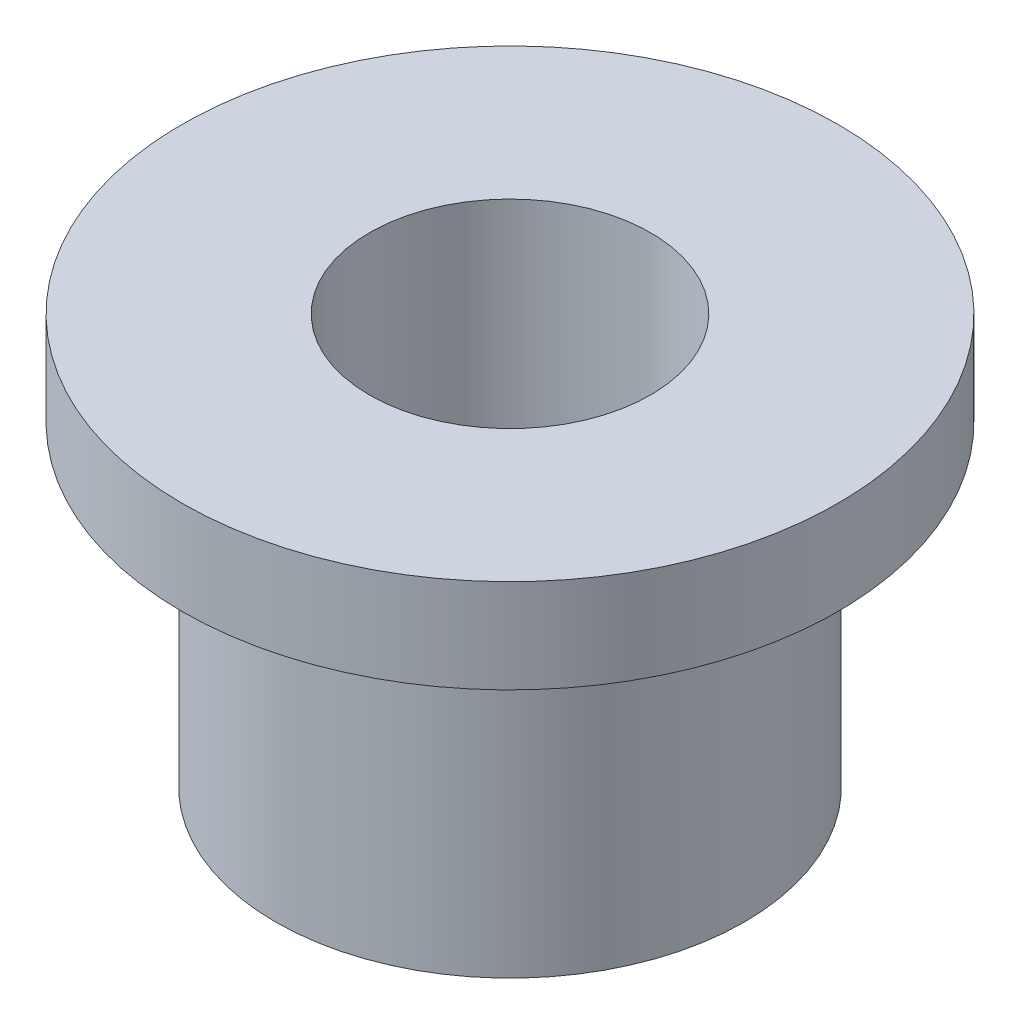
ISO-10303-21;
HEADER;
FILE_DESCRIPTION(('STEP AP214'),'2;1');
FILE_NAME('part.step','',(''),(''),'','','');
FILE_SCHEMA(('AUTOMOTIVE_DESIGN { 1 0 10303 214 1 1 1 1 }'));
ENDSEC;
DATA;
#1=APPLICATION_CONTEXT('core data for automotive mechanical design processes');
#2=APPLICATION_PROTOCOL_DEFINITION('international standard','automotive_design',2000,#1);
#3=PRODUCT_CONTEXT('',#1,'mechanical');
#4=PRODUCT('Part','Part','',(#3));
#5=PRODUCT_RELATED_PRODUCT_CATEGORY('part','',(#4));
#6=PRODUCT_DEFINITION_FORMATION('','',#4);
#7=PRODUCT_DEFINITION_CONTEXT('part definition',#1,'design');
#8=PRODUCT_DEFINITION('design','',#6,#7);
#9=PRODUCT_DEFINITION_SHAPE('','',#8);
#10=(LENGTH_UNIT() NAMED_UNIT(*) SI_UNIT(.MILLI.,.METRE.));
#11=(NAMED_UNIT(*) PLANE_ANGLE_UNIT() SI_UNIT($,.RADIAN.));
#12=(NAMED_UNIT(*) SI_UNIT($,.STERADIAN.) SOLID_ANGLE_UNIT());
#13=UNCERTAINTY_MEASURE_WITH_UNIT(LENGTH_MEASURE(1.E-05),#10,'distance_accuracy_value','');
#14=(GEOMETRIC_REPRESENTATION_CONTEXT(3) GLOBAL_UNCERTAINTY_ASSIGNED_CONTEXT((#13)) GLOBAL_UNIT_ASSIGNED_CONTEXT((#10,
#11,#12)) REPRESENTATION_CONTEXT('',''));
#15=CARTESIAN_POINT('',(0.,0.,0.));
#16=DIRECTION('',(0.,0.,1.));
#17=DIRECTION('',(1.,0.,0.));
#18=AXIS2_PLACEMENT_3D('',#15,#16,#17);
#19=CARTESIAN_POINT('',(0.,0.,0.));
#20=DIRECTION('',(0.,1.,0.));
#21=DIRECTION('',(0.,0.,1.));
#22=AXIS2_PLACEMENT_3D('',#19,#20,#21);
#23=PLANE('',#22);
#24=CARTESIAN_POINT('',(0.,0.,0.));
#25=DIRECTION('',(0.,1.,0.));
#26=DIRECTION('',(0.,0.,1.));
#27=AXIS2_PLACEMENT_3D('',#24,#25,#26);
#28=CIRCLE('',#27,7.9375);
#29=CARTESIAN_POINT('',(0.,0.,7.9375));
#30=VERTEX_POINT('',#29);
#31=EDGE_CURVE('E35',#30,#30,#28,.T.);
#32=ORIENTED_EDGE('',*,*,#31,.F.);
#33=EDGE_LOOP('',(#32));
#34=FACE_BOUND('',#33,.T.);
#35=CARTESIAN_POINT('',(0.,0.,0.));
#36=DIRECTION('',(0.,1.,0.));
#37=DIRECTION('',(0.,0.,1.));
#38=AXIS2_PLACEMENT_3D('',#35,#36,#37);
#39=CIRCLE('',#38,4.7625);
#40=CARTESIAN_POINT('',(0.,0.,4.7625));
#41=VERTEX_POINT('',#40);
#42=EDGE_CURVE('E42',#41,#41,#39,.T.);
#43=ORIENTED_EDGE('',*,*,#42,.T.);
#44=EDGE_LOOP('',(#43));
#45=FACE_BOUND('',#44,.T.);
#46=ADVANCED_FACE('F31',(#34,#45),#23,.F.);
#47=CARTESIAN_POINT('',(0.,10.7,0.));
#48=DIRECTION('',(0.,-1.,0.));
#49=DIRECTION('',(0.,0.,-1.));
#50=AXIS2_PLACEMENT_3D('',#47,#48,#49);
#51=CYLINDRICAL_SURFACE('',#50,7.9375);
#52=CARTESIAN_POINT('',(0.,10.7,0.));
#53=DIRECTION('',(0.,1.,0.));
#54=DIRECTION('',(0.,0.,1.));
#55=AXIS2_PLACEMENT_3D('',#52,#53,#54);
#56=CIRCLE('',#55,7.9375);
#57=CARTESIAN_POINT('',(0.,10.7,7.9375));
#58=VERTEX_POINT('',#57);
#59=EDGE_CURVE('E10',#58,#58,#56,.T.);
#60=ORIENTED_EDGE('',*,*,#59,.F.);
#61=EDGE_LOOP('',(#60));
#62=FACE_BOUND('',#61,.T.);
#63=ORIENTED_EDGE('',*,*,#31,.T.);
#64=EDGE_LOOP('',(#63));
#65=FACE_BOUND('',#64,.T.);
#66=ADVANCED_FACE('F33',(#62,#65),#51,.T.);
#67=CARTESIAN_POINT('',(0.,10.7,0.));
#68=DIRECTION('',(0.,-1.,0.));
#69=DIRECTION('',(0.,0.,-1.));
#70=AXIS2_PLACEMENT_3D('',#67,#68,#69);
#71=CYLINDRICAL_SURFACE('',#70,4.7625);
#72=ORIENTED_EDGE('',*,*,#42,.F.);
#73=EDGE_LOOP('',(#72));
#74=FACE_BOUND('',#73,.T.);
#75=CARTESIAN_POINT('',(0.,13.875,0.));
#76=DIRECTION('',(0.,1.,0.));
#77=DIRECTION('',(0.,0.,1.));
#78=AXIS2_PLACEMENT_3D('',#75,#76,#77);
#79=CIRCLE('',#78,4.7625);
#80=CARTESIAN_POINT('',(0.,13.875,4.7625));
#81=VERTEX_POINT('',#80);
#82=EDGE_CURVE('E50',#81,#81,#79,.T.);
#83=ORIENTED_EDGE('',*,*,#82,.T.);
#84=EDGE_LOOP('',(#83));
#85=FACE_BOUND('',#84,.T.);
#86=ADVANCED_FACE('F56',(#74,#85),#71,.F.);
#87=CARTESIAN_POINT('',(0.,10.7,0.));
#88=DIRECTION('',(0.,1.,0.));
#89=DIRECTION('',(0.,0.,1.));
#90=AXIS2_PLACEMENT_3D('',#87,#88,#89);
#91=PLANE('',#90);
#92=CARTESIAN_POINT('',(0.,10.7,0.));
#93=DIRECTION('',(0.,1.,0.));
#94=DIRECTION('',(0.,0.,1.));
#95=AXIS2_PLACEMENT_3D('',#92,#93,#94);
#96=CIRCLE('',#95,11.1125);
#97=CARTESIAN_POINT('',(0.,10.7,11.1125));
#98=VERTEX_POINT('',#97);
#99=EDGE_CURVE('E47',#98,#98,#96,.T.);
#100=ORIENTED_EDGE('',*,*,#99,.F.);
#101=EDGE_LOOP('',(#100));
#102=FACE_BOUND('',#101,.T.);
#103=ORIENTED_EDGE('',*,*,#59,.T.);
#104=EDGE_LOOP('',(#103));
#105=FACE_BOUND('',#104,.T.);
#106=ADVANCED_FACE('F61',(#102,#105),#91,.F.);
#107=CARTESIAN_POINT('',(0.,13.875,0.));
#108=DIRECTION('',(0.,1.,0.));
#109=DIRECTION('',(0.,0.,1.));
#110=AXIS2_PLACEMENT_3D('',#107,#108,#109);
#111=PLANE('',#110);
#112=CARTESIAN_POINT('',(0.,13.875,0.));
#113=DIRECTION('',(0.,1.,0.));
#114=DIRECTION('',(0.,0.,1.));
#115=AXIS2_PLACEMENT_3D('',#112,#113,#114);
#116=CIRCLE('',#115,11.1125);
#117=CARTESIAN_POINT('',(0.,13.875,11.1125));
#118=VERTEX_POINT('',#117);
#119=EDGE_CURVE('E46',#118,#118,#116,.T.);
#120=ORIENTED_EDGE('',*,*,#119,.T.);
#121=EDGE_LOOP('',(#120));
#122=FACE_BOUND('',#121,.T.);
#123=ORIENTED_EDGE('',*,*,#82,.F.);
#124=EDGE_LOOP('',(#123));
#125=FACE_BOUND('',#124,.T.);
#126=ADVANCED_FACE('F58',(#122,#125),#111,.T.);
#127=CARTESIAN_POINT('',(0.,13.875,0.));
#128=DIRECTION('',(0.,-1.,0.));
#129=DIRECTION('',(0.,0.,-1.));
#130=AXIS2_PLACEMENT_3D('',#127,#128,#129);
#131=CYLINDRICAL_SURFACE('',#130,11.1125);
#132=ORIENTED_EDGE('',*,*,#119,.F.);
#133=EDGE_LOOP('',(#132));
#134=FACE_BOUND('',#133,.T.);
#135=ORIENTED_EDGE('',*,*,#99,.T.);
#136=EDGE_LOOP('',(#135));
#137=FACE_BOUND('',#136,.T.);
#138=ADVANCED_FACE('F60',(#134,#137),#131,.T.);
#139=CLOSED_SHELL('',(#46,#66,#86,#106,#126,#138));
#140=MANIFOLD_SOLID_BREP('B2',#139);
#141=ADVANCED_BREP_SHAPE_REPRESENTATION('',(#18,#140),#14);
#142=SHAPE_DEFINITION_REPRESENTATION(#9,#141);
ENDSEC;
END-ISO-10303-21;
